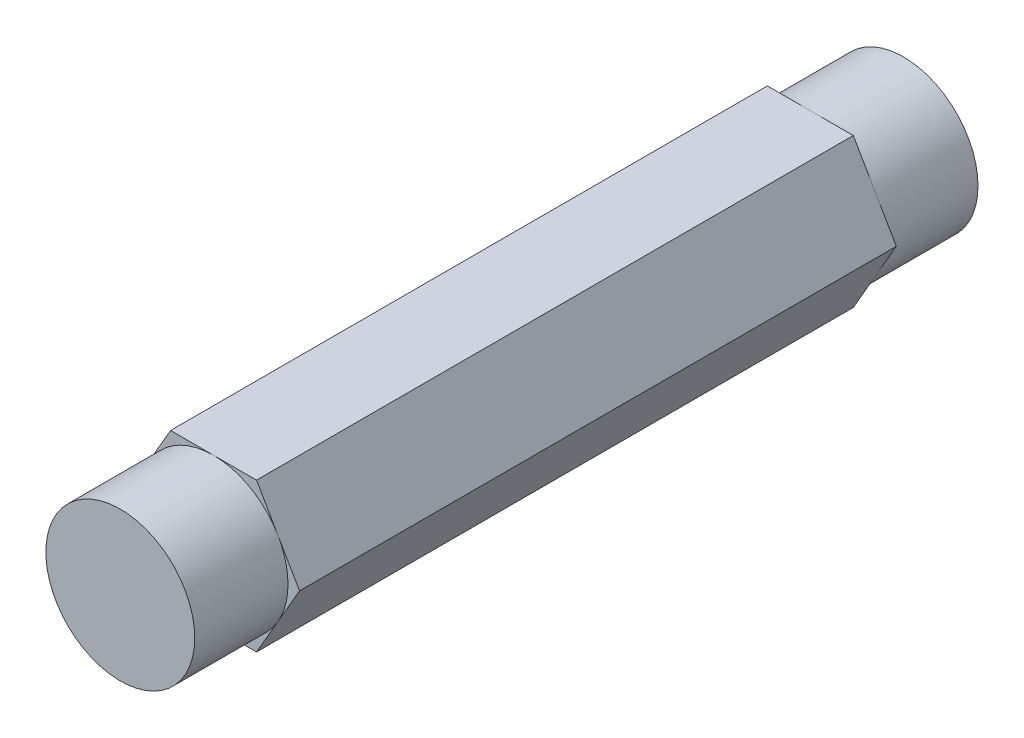
ISO-10303-21;
HEADER;
FILE_DESCRIPTION(('STEP AP214'),'2;1');
FILE_NAME('part.step','',(''),(''),'','','');
FILE_SCHEMA(('AUTOMOTIVE_DESIGN { 1 0 10303 214 1 1 1 1 }'));
ENDSEC;
DATA;
#1=APPLICATION_CONTEXT('core data for automotive mechanical design processes');
#2=APPLICATION_PROTOCOL_DEFINITION('international standard','automotive_design',2000,#1);
#3=PRODUCT_CONTEXT('',#1,'mechanical');
#4=PRODUCT('Part','Part','',(#3));
#5=PRODUCT_RELATED_PRODUCT_CATEGORY('part','',(#4));
#6=PRODUCT_DEFINITION_FORMATION('','',#4);
#7=PRODUCT_DEFINITION_CONTEXT('part definition',#1,'design');
#8=PRODUCT_DEFINITION('design','',#6,#7);
#9=PRODUCT_DEFINITION_SHAPE('','',#8);
#10=(LENGTH_UNIT() NAMED_UNIT(*) SI_UNIT(.MILLI.,.METRE.));
#11=(NAMED_UNIT(*) PLANE_ANGLE_UNIT() SI_UNIT($,.RADIAN.));
#12=(NAMED_UNIT(*) SI_UNIT($,.STERADIAN.) SOLID_ANGLE_UNIT());
#13=UNCERTAINTY_MEASURE_WITH_UNIT(LENGTH_MEASURE(1.E-05),#10,'distance_accuracy_value','');
#14=(GEOMETRIC_REPRESENTATION_CONTEXT(3) GLOBAL_UNCERTAINTY_ASSIGNED_CONTEXT((#13)) GLOBAL_UNIT_ASSIGNED_CONTEXT((#10,
#11,#12)) REPRESENTATION_CONTEXT('',''));
#15=CARTESIAN_POINT('',(0.,0.,0.));
#16=DIRECTION('',(0.,0.,1.));
#17=DIRECTION('',(1.,0.,0.));
#18=AXIS2_PLACEMENT_3D('',#15,#16,#17);
#19=CARTESIAN_POINT('',(0.,-6.35,33.401));
#20=DIRECTION('',(0.,1.,0.));
#21=DIRECTION('',(-1.,0.,0.));
#22=AXIS2_PLACEMENT_3D('',#19,#20,#21);
#23=PLANE('',#22);
#24=DIRECTION('',(-1.,0.,0.));
#25=VECTOR('',#24,1.);
#26=CARTESIAN_POINT('',(0.,-6.35,-25.4508));
#27=LINE('',#26,#25);
#28=CARTESIAN_POINT('',(3.66617420935412,-6.35,-25.4508));
#29=VERTEX_POINT('',#28);
#30=CARTESIAN_POINT('',(0.,-6.35,-25.4508));
#31=VERTEX_POINT('',#30);
#32=EDGE_CURVE('E315',#29,#31,#27,.T.);
#33=ORIENTED_EDGE('',*,*,#32,.F.);
#34=DIRECTION('',(0.,0.,-1.));
#35=VECTOR('',#34,1.);
#36=CARTESIAN_POINT('',(3.66617420935412,-6.35,33.401));
#37=LINE('',#36,#35);
#38=CARTESIAN_POINT('',(3.66617420935412,-6.35,25.4508));
#39=VERTEX_POINT('',#38);
#40=EDGE_CURVE('E228',#39,#29,#37,.T.);
#41=ORIENTED_EDGE('',*,*,#40,.F.);
#42=DIRECTION('',(1.,0.,0.));
#43=VECTOR('',#42,1.);
#44=CARTESIAN_POINT('',(0.,-6.35,25.4508));
#45=LINE('',#44,#43);
#46=CARTESIAN_POINT('',(0.,-6.35,25.4508));
#47=VERTEX_POINT('',#46);
#48=EDGE_CURVE('E207',#47,#39,#45,.T.);
#49=ORIENTED_EDGE('',*,*,#48,.F.);
#50=CARTESIAN_POINT('',(-3.66617420935412,-6.35,25.4508));
#51=VERTEX_POINT('',#50);
#52=EDGE_CURVE('E210',#51,#47,#45,.T.);
#53=ORIENTED_EDGE('',*,*,#52,.F.);
#54=DIRECTION('',(0.,0.,-1.));
#55=VECTOR('',#54,1.);
#56=CARTESIAN_POINT('',(-3.66617420935412,-6.35,33.401));
#57=LINE('',#56,#55);
#58=CARTESIAN_POINT('',(-3.66617420935412,-6.35,-25.4508));
#59=VERTEX_POINT('',#58);
#60=EDGE_CURVE('E211',#51,#59,#57,.T.);
#61=ORIENTED_EDGE('',*,*,#60,.T.);
#62=EDGE_CURVE('E305',#31,#59,#27,.T.);
#63=ORIENTED_EDGE('',*,*,#62,.F.);
#64=EDGE_LOOP('',(#33,#41,#49,#53,#61,#63));
#65=FACE_BOUND('',#64,.T.);
#66=ADVANCED_FACE('F49',(#65),#23,.F.);
#67=CARTESIAN_POINT('',(5.49926131403119,-3.175,33.401));
#68=DIRECTION('',(-0.866025403784439,0.5,0.));
#69=DIRECTION('',(-0.5,-0.866025403784439,0.));
#70=AXIS2_PLACEMENT_3D('',#67,#68,#69);
#71=PLANE('',#70);
#72=DIRECTION('',(-0.5,-0.866025403784439,0.));
#73=VECTOR('',#72,1.);
#74=CARTESIAN_POINT('',(5.49926131403119,-3.175,-25.4508));
#75=LINE('',#74,#73);
#76=CARTESIAN_POINT('',(7.33234841870825,0.,-25.4508));
#77=VERTEX_POINT('',#76);
#78=CARTESIAN_POINT('',(5.49926131403119,-3.175,-25.4508));
#79=VERTEX_POINT('',#78);
#80=EDGE_CURVE('E160',#77,#79,#75,.T.);
#81=ORIENTED_EDGE('',*,*,#80,.F.);
#82=DIRECTION('',(0.,0.,-1.));
#83=VECTOR('',#82,1.);
#84=CARTESIAN_POINT('',(7.33234841870825,0.,33.401));
#85=LINE('',#84,#83);
#86=CARTESIAN_POINT('',(7.33234841870825,0.,25.4508));
#87=VERTEX_POINT('',#86);
#88=EDGE_CURVE('E178',#87,#77,#85,.T.);
#89=ORIENTED_EDGE('',*,*,#88,.F.);
#90=DIRECTION('',(0.5,0.866025403784439,0.));
#91=VECTOR('',#90,1.);
#92=CARTESIAN_POINT('',(5.49926131403119,-3.175,25.4508));
#93=LINE('',#92,#91);
#94=CARTESIAN_POINT('',(5.49926131403119,-3.175,25.4508));
#95=VERTEX_POINT('',#94);
#96=EDGE_CURVE('E203',#95,#87,#93,.T.);
#97=ORIENTED_EDGE('',*,*,#96,.F.);
#98=EDGE_CURVE('E206',#39,#95,#93,.T.);
#99=ORIENTED_EDGE('',*,*,#98,.F.);
#100=ORIENTED_EDGE('',*,*,#40,.T.);
#101=EDGE_CURVE('E185',#79,#29,#75,.T.);
#102=ORIENTED_EDGE('',*,*,#101,.F.);
#103=EDGE_LOOP('',(#81,#89,#97,#99,#100,#102));
#104=FACE_BOUND('',#103,.T.);
#105=ADVANCED_FACE('F326',(#104),#71,.F.);
#106=CARTESIAN_POINT('',(5.49926131403119,3.175,33.401));
#107=DIRECTION('',(-0.866025403784438,-0.5,0.));
#108=DIRECTION('',(0.5,-0.866025403784439,0.));
#109=AXIS2_PLACEMENT_3D('',#106,#107,#108);
#110=PLANE('',#109);
#111=DIRECTION('',(0.5,-0.866025403784439,0.));
#112=VECTOR('',#111,1.);
#113=CARTESIAN_POINT('',(5.49926131403119,3.175,-25.4508));
#114=LINE('',#113,#112);
#115=CARTESIAN_POINT('',(3.66617420935412,6.35,-25.4508));
#116=VERTEX_POINT('',#115);
#117=CARTESIAN_POINT('',(5.49926131403118,3.175,-25.4508));
#118=VERTEX_POINT('',#117);
#119=EDGE_CURVE('E140',#116,#118,#114,.T.);
#120=ORIENTED_EDGE('',*,*,#119,.F.);
#121=DIRECTION('',(0.,0.,-1.));
#122=VECTOR('',#121,1.);
#123=CARTESIAN_POINT('',(3.66617420935412,6.35,33.401));
#124=LINE('',#123,#122);
#125=CARTESIAN_POINT('',(3.66617420935412,6.35,25.4508));
#126=VERTEX_POINT('',#125);
#127=EDGE_CURVE('E223',#126,#116,#124,.T.);
#128=ORIENTED_EDGE('',*,*,#127,.F.);
#129=DIRECTION('',(-0.5,0.866025403784439,0.));
#130=VECTOR('',#129,1.);
#131=CARTESIAN_POINT('',(5.49926131403119,3.175,25.4508));
#132=LINE('',#131,#130);
#133=CARTESIAN_POINT('',(5.49926131403118,3.175,25.4508));
#134=VERTEX_POINT('',#133);
#135=EDGE_CURVE('E199',#134,#126,#132,.T.);
#136=ORIENTED_EDGE('',*,*,#135,.F.);
#137=EDGE_CURVE('E202',#87,#134,#132,.T.);
#138=ORIENTED_EDGE('',*,*,#137,.F.);
#139=ORIENTED_EDGE('',*,*,#88,.T.);
#140=EDGE_CURVE('E153',#118,#77,#114,.T.);
#141=ORIENTED_EDGE('',*,*,#140,.F.);
#142=EDGE_LOOP('',(#120,#128,#136,#138,#139,#141));
#143=FACE_BOUND('',#142,.T.);
#144=ADVANCED_FACE('F175',(#143),#110,.F.);
#145=CARTESIAN_POINT('',(0.,6.35,33.401));
#146=DIRECTION('',(0.,-1.,0.));
#147=DIRECTION('',(1.,0.,0.));
#148=AXIS2_PLACEMENT_3D('',#145,#146,#147);
#149=PLANE('',#148);
#150=DIRECTION('',(1.,0.,0.));
#151=VECTOR('',#150,1.);
#152=CARTESIAN_POINT('',(0.,6.35,-25.4508));
#153=LINE('',#152,#151);
#154=CARTESIAN_POINT('',(-3.66617420935412,6.35,-25.4508));
#155=VERTEX_POINT('',#154);
#156=CARTESIAN_POINT('',(0.,6.35,-25.4508));
#157=VERTEX_POINT('',#156);
#158=EDGE_CURVE('E182',#155,#157,#153,.T.);
#159=ORIENTED_EDGE('',*,*,#158,.F.);
#160=DIRECTION('',(0.,0.,-1.));
#161=VECTOR('',#160,1.);
#162=CARTESIAN_POINT('',(-3.66617420935412,6.35,33.401));
#163=LINE('',#162,#161);
#164=CARTESIAN_POINT('',(-3.66617420935412,6.35,25.4508));
#165=VERTEX_POINT('',#164);
#166=EDGE_CURVE('E219',#165,#155,#163,.T.);
#167=ORIENTED_EDGE('',*,*,#166,.F.);
#168=DIRECTION('',(-1.,0.,0.));
#169=VECTOR('',#168,1.);
#170=CARTESIAN_POINT('',(0.,6.35,25.4508));
#171=LINE('',#170,#169);
#172=CARTESIAN_POINT('',(0.,6.35,25.4508));
#173=VERTEX_POINT('',#172);
#174=EDGE_CURVE('E195',#173,#165,#171,.T.);
#175=ORIENTED_EDGE('',*,*,#174,.F.);
#176=EDGE_CURVE('E198',#126,#173,#171,.T.);
#177=ORIENTED_EDGE('',*,*,#176,.F.);
#178=ORIENTED_EDGE('',*,*,#127,.T.);
#179=EDGE_CURVE('E146',#157,#116,#153,.T.);
#180=ORIENTED_EDGE('',*,*,#179,.F.);
#181=EDGE_LOOP('',(#159,#167,#175,#177,#178,#180));
#182=FACE_BOUND('',#181,.T.);
#183=ADVANCED_FACE('F293',(#182),#149,.F.);
#184=CARTESIAN_POINT('',(-5.49926131403118,3.175,33.401));
#185=DIRECTION('',(0.866025403784439,-0.499999999999999,0.));
#186=DIRECTION('',(0.5,0.866025403784439,0.));
#187=AXIS2_PLACEMENT_3D('',#184,#185,#186);
#188=PLANE('',#187);
#189=DIRECTION('',(0.5,0.866025403784439,0.));
#190=VECTOR('',#189,1.);
#191=CARTESIAN_POINT('',(-5.49926131403118,3.175,-25.4508));
#192=LINE('',#191,#190);
#193=CARTESIAN_POINT('',(-7.33234841870824,0.,-25.4508));
#194=VERTEX_POINT('',#193);
#195=CARTESIAN_POINT('',(-5.49926131403119,3.175,-25.4508));
#196=VERTEX_POINT('',#195);
#197=EDGE_CURVE('E173',#194,#196,#192,.T.);
#198=ORIENTED_EDGE('',*,*,#197,.F.);
#199=DIRECTION('',(0.,0.,-1.));
#200=VECTOR('',#199,1.);
#201=CARTESIAN_POINT('',(-7.33234841870824,0.,33.401));
#202=LINE('',#201,#200);
#203=CARTESIAN_POINT('',(-7.33234841870824,0.,25.4508));
#204=VERTEX_POINT('',#203);
#205=EDGE_CURVE('E215',#204,#194,#202,.T.);
#206=ORIENTED_EDGE('',*,*,#205,.F.);
#207=DIRECTION('',(-0.5,-0.866025403784439,0.));
#208=VECTOR('',#207,1.);
#209=CARTESIAN_POINT('',(-5.49926131403118,3.175,25.4508));
#210=LINE('',#209,#208);
#211=CARTESIAN_POINT('',(-5.49926131403119,3.175,25.4508));
#212=VERTEX_POINT('',#211);
#213=EDGE_CURVE('E190',#212,#204,#210,.T.);
#214=ORIENTED_EDGE('',*,*,#213,.F.);
#215=EDGE_CURVE('E194',#165,#212,#210,.T.);
#216=ORIENTED_EDGE('',*,*,#215,.F.);
#217=ORIENTED_EDGE('',*,*,#166,.T.);
#218=EDGE_CURVE('E307',#196,#155,#192,.T.);
#219=ORIENTED_EDGE('',*,*,#218,.F.);
#220=EDGE_LOOP('',(#198,#206,#214,#216,#217,#219));
#221=FACE_BOUND('',#220,.T.);
#222=ADVANCED_FACE('F300',(#221),#188,.F.);
#223=CARTESIAN_POINT('',(-5.49926131403118,-3.175,33.401));
#224=DIRECTION('',(0.866025403784439,0.5,0.));
#225=DIRECTION('',(-0.5,0.866025403784439,0.));
#226=AXIS2_PLACEMENT_3D('',#223,#224,#225);
#227=PLANE('',#226);
#228=DIRECTION('',(-0.5,0.866025403784439,0.));
#229=VECTOR('',#228,1.);
#230=CARTESIAN_POINT('',(-5.49926131403118,-3.175,-25.4508));
#231=LINE('',#230,#229);
#232=CARTESIAN_POINT('',(-5.49926131403118,-3.175,-25.4508));
#233=VERTEX_POINT('',#232);
#234=EDGE_CURVE('E12',#59,#233,#231,.T.);
#235=ORIENTED_EDGE('',*,*,#234,.F.);
#236=ORIENTED_EDGE('',*,*,#60,.F.);
#237=DIRECTION('',(0.5,-0.866025403784439,0.));
#238=VECTOR('',#237,1.);
#239=CARTESIAN_POINT('',(-5.49926131403118,-3.175,25.4508));
#240=LINE('',#239,#238);
#241=CARTESIAN_POINT('',(-5.49926131403118,-3.175,25.4508));
#242=VERTEX_POINT('',#241);
#243=EDGE_CURVE('E236',#242,#51,#240,.T.);
#244=ORIENTED_EDGE('',*,*,#243,.F.);
#245=EDGE_CURVE('E238',#204,#242,#240,.T.);
#246=ORIENTED_EDGE('',*,*,#245,.F.);
#247=ORIENTED_EDGE('',*,*,#205,.T.);
#248=EDGE_CURVE('E52',#233,#194,#231,.T.);
#249=ORIENTED_EDGE('',*,*,#248,.F.);
#250=EDGE_LOOP('',(#235,#236,#244,#246,#247,#249));
#251=FACE_BOUND('',#250,.T.);
#252=ADVANCED_FACE('F256',(#251),#227,.F.);
#253=CARTESIAN_POINT('',(0.,0.,25.4508));
#254=DIRECTION('',(0.,0.,1.));
#255=DIRECTION('',(1.,0.,0.));
#256=AXIS2_PLACEMENT_3D('',#253,#254,#255);
#257=PLANE('',#256);
#258=ORIENTED_EDGE('',*,*,#52,.T.);
#259=CARTESIAN_POINT('',(0.,0.,25.4508));
#260=DIRECTION('',(0.,0.,1.));
#261=DIRECTION('',(1.,0.,0.));
#262=AXIS2_PLACEMENT_3D('',#259,#260,#261);
#263=CIRCLE('',#262,6.35);
#264=EDGE_CURVE('E261',#242,#47,#263,.T.);
#265=ORIENTED_EDGE('',*,*,#264,.F.);
#266=ORIENTED_EDGE('',*,*,#243,.T.);
#267=EDGE_LOOP('',(#258,#265,#266));
#268=FACE_BOUND('',#267,.T.);
#269=ADVANCED_FACE('F259',(#268),#257,.T.);
#270=ORIENTED_EDGE('',*,*,#48,.T.);
#271=ORIENTED_EDGE('',*,*,#98,.T.);
#272=EDGE_CURVE('E276',#47,#95,#263,.T.);
#273=ORIENTED_EDGE('',*,*,#272,.F.);
#274=EDGE_LOOP('',(#270,#271,#273));
#275=FACE_BOUND('',#274,.T.);
#276=ADVANCED_FACE('F328',(#275),#257,.T.);
#277=ORIENTED_EDGE('',*,*,#96,.T.);
#278=ORIENTED_EDGE('',*,*,#137,.T.);
#279=EDGE_CURVE('E152',#95,#134,#263,.T.);
#280=ORIENTED_EDGE('',*,*,#279,.F.);
#281=EDGE_LOOP('',(#277,#278,#280));
#282=FACE_BOUND('',#281,.T.);
#283=ADVANCED_FACE('F330',(#282),#257,.T.);
#284=ORIENTED_EDGE('',*,*,#135,.T.);
#285=ORIENTED_EDGE('',*,*,#176,.T.);
#286=EDGE_CURVE('E186',#134,#173,#263,.T.);
#287=ORIENTED_EDGE('',*,*,#286,.F.);
#288=EDGE_LOOP('',(#284,#285,#287));
#289=FACE_BOUND('',#288,.T.);
#290=ADVANCED_FACE('F288',(#289),#257,.T.);
#291=ORIENTED_EDGE('',*,*,#174,.T.);
#292=ORIENTED_EDGE('',*,*,#215,.T.);
#293=EDGE_CURVE('E191',#173,#212,#263,.T.);
#294=ORIENTED_EDGE('',*,*,#293,.F.);
#295=EDGE_LOOP('',(#291,#292,#294));
#296=FACE_BOUND('',#295,.T.);
#297=ADVANCED_FACE('F297',(#296),#257,.T.);
#298=ORIENTED_EDGE('',*,*,#213,.T.);
#299=ORIENTED_EDGE('',*,*,#245,.T.);
#300=EDGE_CURVE('E72',#212,#242,#263,.T.);
#301=ORIENTED_EDGE('',*,*,#300,.F.);
#302=EDGE_LOOP('',(#298,#299,#301));
#303=FACE_BOUND('',#302,.T.);
#304=ADVANCED_FACE('F250',(#303),#257,.T.);
#305=CARTESIAN_POINT('',(0.,0.,25.4508));
#306=DIRECTION('',(0.,0.,1.));
#307=DIRECTION('',(1.,0.,0.));
#308=AXIS2_PLACEMENT_3D('',#305,#306,#307);
#309=CYLINDRICAL_SURFACE('',#308,6.35);
#310=CARTESIAN_POINT('',(0.,0.,33.401));
#311=DIRECTION('',(0.,0.,1.));
#312=DIRECTION('',(1.,0.,0.));
#313=AXIS2_PLACEMENT_3D('',#310,#311,#312);
#314=CIRCLE('',#313,6.35);
#315=CARTESIAN_POINT('',(6.35,0.,33.401));
#316=VERTEX_POINT('',#315);
#317=EDGE_CURVE('E232',#316,#316,#314,.T.);
#318=ORIENTED_EDGE('',*,*,#317,.F.);
#319=EDGE_LOOP('',(#318));
#320=FACE_BOUND('',#319,.T.);
#321=ORIENTED_EDGE('',*,*,#264,.T.);
#322=ORIENTED_EDGE('',*,*,#272,.T.);
#323=ORIENTED_EDGE('',*,*,#279,.T.);
#324=ORIENTED_EDGE('',*,*,#286,.T.);
#325=ORIENTED_EDGE('',*,*,#293,.T.);
#326=ORIENTED_EDGE('',*,*,#300,.T.);
#327=EDGE_LOOP('',(#321,#322,#323,#324,#325,#326));
#328=FACE_BOUND('',#327,.T.);
#329=ADVANCED_FACE('F282',(#320,#328),#309,.T.);
#330=CARTESIAN_POINT('',(0.,0.,33.401));
#331=DIRECTION('',(0.,0.,1.));
#332=DIRECTION('',(1.,0.,0.));
#333=AXIS2_PLACEMENT_3D('',#330,#331,#332);
#334=PLANE('',#333);
#335=ORIENTED_EDGE('',*,*,#317,.T.);
#336=EDGE_LOOP('',(#335));
#337=FACE_BOUND('',#336,.T.);
#338=ADVANCED_FACE('F356',(#337),#334,.T.);
#339=CARTESIAN_POINT('',(0.,0.,-25.4508));
#340=DIRECTION('',(0.,0.,-1.));
#341=DIRECTION('',(-1.,0.,0.));
#342=AXIS2_PLACEMENT_3D('',#339,#340,#341);
#343=PLANE('',#342);
#344=ORIENTED_EDGE('',*,*,#119,.T.);
#345=CARTESIAN_POINT('',(0.,0.,-25.4508));
#346=DIRECTION('',(0.,0.,1.));
#347=DIRECTION('',(1.,0.,0.));
#348=AXIS2_PLACEMENT_3D('',#345,#346,#347);
#349=CIRCLE('',#348,6.35);
#350=EDGE_CURVE('E144',#118,#157,#349,.T.);
#351=ORIENTED_EDGE('',*,*,#350,.T.);
#352=ORIENTED_EDGE('',*,*,#179,.T.);
#353=EDGE_LOOP('',(#344,#351,#352));
#354=FACE_BOUND('',#353,.T.);
#355=ADVANCED_FACE('F142',(#354),#343,.T.);
#356=ORIENTED_EDGE('',*,*,#140,.T.);
#357=ORIENTED_EDGE('',*,*,#80,.T.);
#358=EDGE_CURVE('E157',#79,#118,#349,.T.);
#359=ORIENTED_EDGE('',*,*,#358,.T.);
#360=EDGE_LOOP('',(#356,#357,#359));
#361=FACE_BOUND('',#360,.T.);
#362=ADVANCED_FACE('F158',(#361),#343,.T.);
#363=ORIENTED_EDGE('',*,*,#101,.T.);
#364=ORIENTED_EDGE('',*,*,#32,.T.);
#365=EDGE_CURVE('E165',#31,#79,#349,.T.);
#366=ORIENTED_EDGE('',*,*,#365,.T.);
#367=EDGE_LOOP('',(#363,#364,#366));
#368=FACE_BOUND('',#367,.T.);
#369=ADVANCED_FACE('F379',(#368),#343,.T.);
#370=ORIENTED_EDGE('',*,*,#158,.T.);
#371=EDGE_CURVE('E171',#157,#196,#349,.T.);
#372=ORIENTED_EDGE('',*,*,#371,.T.);
#373=ORIENTED_EDGE('',*,*,#218,.T.);
#374=EDGE_LOOP('',(#370,#372,#373));
#375=FACE_BOUND('',#374,.T.);
#376=ADVANCED_FACE('F312',(#375),#343,.T.);
#377=ORIENTED_EDGE('',*,*,#62,.T.);
#378=ORIENTED_EDGE('',*,*,#234,.T.);
#379=EDGE_CURVE('E309',#233,#31,#349,.T.);
#380=ORIENTED_EDGE('',*,*,#379,.T.);
#381=EDGE_LOOP('',(#377,#378,#380));
#382=FACE_BOUND('',#381,.T.);
#383=ADVANCED_FACE('F321',(#382),#343,.T.);
#384=ORIENTED_EDGE('',*,*,#197,.T.);
#385=EDGE_CURVE('E64',#196,#233,#349,.T.);
#386=ORIENTED_EDGE('',*,*,#385,.T.);
#387=ORIENTED_EDGE('',*,*,#248,.T.);
#388=EDGE_LOOP('',(#384,#386,#387));
#389=FACE_BOUND('',#388,.T.);
#390=ADVANCED_FACE('F303',(#389),#343,.T.);
#391=CARTESIAN_POINT('',(0.,0.,-25.4508));
#392=DIRECTION('',(0.,0.,-1.));
#393=DIRECTION('',(-1.,0.,0.));
#394=AXIS2_PLACEMENT_3D('',#391,#392,#393);
#395=CYLINDRICAL_SURFACE('',#394,6.35);
#396=ORIENTED_EDGE('',*,*,#365,.F.);
#397=ORIENTED_EDGE('',*,*,#379,.F.);
#398=ORIENTED_EDGE('',*,*,#385,.F.);
#399=ORIENTED_EDGE('',*,*,#371,.F.);
#400=ORIENTED_EDGE('',*,*,#350,.F.);
#401=ORIENTED_EDGE('',*,*,#358,.F.);
#402=EDGE_LOOP('',(#396,#397,#398,#399,#400,#401));
#403=FACE_BOUND('',#402,.T.);
#404=CARTESIAN_POINT('',(0.,0.,-33.401));
#405=DIRECTION('',(0.,0.,1.));
#406=DIRECTION('',(1.,0.,0.));
#407=AXIS2_PLACEMENT_3D('',#404,#405,#406);
#408=CIRCLE('',#407,6.35);
#409=CARTESIAN_POINT('',(6.35,0.,-33.401));
#410=VERTEX_POINT('',#409);
#411=EDGE_CURVE('E239',#410,#410,#408,.F.);
#412=ORIENTED_EDGE('',*,*,#411,.F.);
#413=EDGE_LOOP('',(#412));
#414=FACE_BOUND('',#413,.T.);
#415=ADVANCED_FACE('F168',(#403,#414),#395,.T.);
#416=CARTESIAN_POINT('',(0.,0.,-33.401));
#417=DIRECTION('',(0.,0.,1.));
#418=DIRECTION('',(1.,0.,0.));
#419=AXIS2_PLACEMENT_3D('',#416,#417,#418);
#420=PLANE('',#419);
#421=ORIENTED_EDGE('',*,*,#411,.T.);
#422=EDGE_LOOP('',(#421));
#423=FACE_BOUND('',#422,.T.);
#424=ADVANCED_FACE('F354',(#423),#420,.F.);
#425=CLOSED_SHELL('',(#66,#105,#144,#183,#222,#252,#269,#276,#283,#290,#297,#304,#329,#338,#355,
#362,#369,#376,#383,#390,#415,#424));
#426=MANIFOLD_SOLID_BREP('B2',#425);
#427=ADVANCED_BREP_SHAPE_REPRESENTATION('',(#18,#426),#14);
#428=SHAPE_DEFINITION_REPRESENTATION(#9,#427);
ENDSEC;
END-ISO-10303-21;
